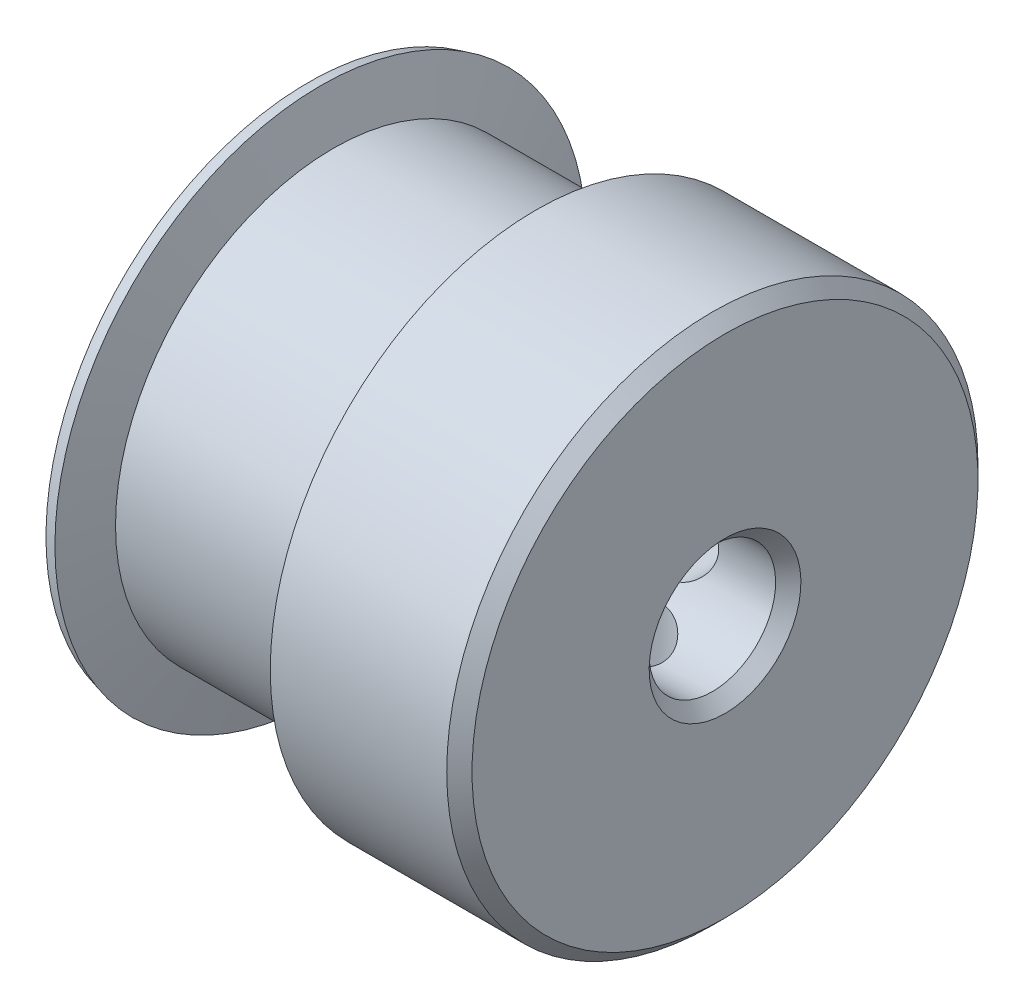
ISO-10303-21;
HEADER;
FILE_DESCRIPTION(('STEP AP214'),'2;1');
FILE_NAME('part.step','',(''),(''),'','','');
FILE_SCHEMA(('AUTOMOTIVE_DESIGN { 1 0 10303 214 1 1 1 1 }'));
ENDSEC;
DATA;
#1=APPLICATION_CONTEXT('core data for automotive mechanical design processes');
#2=APPLICATION_PROTOCOL_DEFINITION('international standard','automotive_design',2000,#1);
#3=PRODUCT_CONTEXT('',#1,'mechanical');
#4=PRODUCT('Part','Part','',(#3));
#5=PRODUCT_RELATED_PRODUCT_CATEGORY('part','',(#4));
#6=PRODUCT_DEFINITION_FORMATION('','',#4);
#7=PRODUCT_DEFINITION_CONTEXT('part definition',#1,'design');
#8=PRODUCT_DEFINITION('design','',#6,#7);
#9=PRODUCT_DEFINITION_SHAPE('','',#8);
#10=(LENGTH_UNIT() NAMED_UNIT(*) SI_UNIT(.MILLI.,.METRE.));
#11=(NAMED_UNIT(*) PLANE_ANGLE_UNIT() SI_UNIT($,.RADIAN.));
#12=(NAMED_UNIT(*) SI_UNIT($,.STERADIAN.) SOLID_ANGLE_UNIT());
#13=UNCERTAINTY_MEASURE_WITH_UNIT(LENGTH_MEASURE(1.E-05),#10,'distance_accuracy_value','');
#14=(GEOMETRIC_REPRESENTATION_CONTEXT(3) GLOBAL_UNCERTAINTY_ASSIGNED_CONTEXT((#13)) GLOBAL_UNIT_ASSIGNED_CONTEXT((#10,
#11,#12)) REPRESENTATION_CONTEXT('',''));
#15=CARTESIAN_POINT('',(0.,0.,0.));
#16=DIRECTION('',(0.,0.,1.));
#17=DIRECTION('',(1.,0.,0.));
#18=AXIS2_PLACEMENT_3D('',#15,#16,#17);
#19=CARTESIAN_POINT('',(-7.99999999999999,8.61000000000002,0.));
#20=DIRECTION('',(1.,0.,0.));
#21=DIRECTION('',(0.,1.,0.));
#22=AXIS2_PLACEMENT_3D('',#19,#20,#21);
#23=PLANE('',#22);
#24=CARTESIAN_POINT('',(-8.00000000000001,0.,0.));
#25=DIRECTION('',(-1.,0.,0.));
#26=DIRECTION('',(0.,-1.,0.));
#27=AXIS2_PLACEMENT_3D('',#24,#25,#26);
#28=CIRCLE('',#27,3.);
#29=CARTESIAN_POINT('',(-8.00000000000002,-3.,0.));
#30=VERTEX_POINT('',#29);
#31=EDGE_CURVE('E10',#30,#30,#28,.T.);
#32=ORIENTED_EDGE('',*,*,#31,.F.);
#33=EDGE_LOOP('',(#32));
#34=FACE_BOUND('',#33,.T.);
#35=CARTESIAN_POINT('',(-8.00000000000002,0.,0.));
#36=DIRECTION('',(-1.,0.,0.));
#37=DIRECTION('',(0.,-1.,0.));
#38=AXIS2_PLACEMENT_3D('',#35,#36,#37);
#39=CIRCLE('',#38,8.61000000000002);
#40=CARTESIAN_POINT('',(-8.00000000000005,-8.61000000000002,0.));
#41=VERTEX_POINT('',#40);
#42=EDGE_CURVE('E71',#41,#41,#39,.T.);
#43=ORIENTED_EDGE('',*,*,#42,.T.);
#44=EDGE_LOOP('',(#43));
#45=FACE_BOUND('',#44,.T.);
#46=ADVANCED_FACE('F31',(#34,#45),#23,.F.);
#47=CARTESIAN_POINT('',(-8.00000000000001,0.,0.));
#48=DIRECTION('',(-1.,0.,0.));
#49=DIRECTION('',(0.,-1.,0.));
#50=AXIS2_PLACEMENT_3D('',#47,#48,#49);
#51=CONICAL_SURFACE('',#50,3.,0.785398163397425);
#52=CARTESIAN_POINT('',(-7.50000000000001,0.,0.));
#53=DIRECTION('',(-1.,0.,0.));
#54=DIRECTION('',(0.,-1.,0.));
#55=AXIS2_PLACEMENT_3D('',#52,#53,#54);
#56=CIRCLE('',#55,2.50000000000003);
#57=CARTESIAN_POINT('',(-7.50000000000002,-2.50000000000003,0.));
#58=VERTEX_POINT('',#57);
#59=EDGE_CURVE('E37',#58,#58,#56,.T.);
#60=ORIENTED_EDGE('',*,*,#59,.F.);
#61=EDGE_LOOP('',(#60));
#62=FACE_BOUND('',#61,.T.);
#63=ORIENTED_EDGE('',*,*,#31,.T.);
#64=EDGE_LOOP('',(#63));
#65=FACE_BOUND('',#64,.T.);
#66=ADVANCED_FACE('F145',(#62,#65),#51,.F.);
#67=CARTESIAN_POINT('',(-8.00000000000001,0.,0.));
#68=DIRECTION('',(-1.,0.,0.));
#69=DIRECTION('',(0.,-1.,0.));
#70=AXIS2_PLACEMENT_3D('',#67,#68,#69);
#71=CYLINDRICAL_SURFACE('',#70,2.50000000000004);
#72=CARTESIAN_POINT('',(4.01203103194989,-2.00000000000008,1.5));
#73=CARTESIAN_POINT('',(4.08751000723953,-1.9999941664252,1.50000404108592));
#74=CARTESIAN_POINT('',(4.16296946602969,-2.00433633903489,1.49426852824014));
#75=CARTESIAN_POINT('',(4.31135493591211,-2.02092590613891,1.47174965152787));
#76=CARTESIAN_POINT('',(4.38427821933499,-2.03318155043105,1.45495475788936));
#77=CARTESIAN_POINT('',(4.52511467362717,-2.06362339034738,1.41143486335796));
#78=CARTESIAN_POINT('',(4.59305986998516,-2.08176666183128,1.3847815450315));
#79=CARTESIAN_POINT('',(4.72346848531782,-2.12185904995844,1.3225290928302));
#80=CARTESIAN_POINT('',(4.78593026164503,-2.14380930122424,1.28692729054693));
#81=CARTESIAN_POINT('',(4.91198004861398,-2.1922859458755,1.20271292747644));
#82=CARTESIAN_POINT('',(4.97477198907384,-2.2190437103767,1.15304179435289));
#83=CARTESIAN_POINT('',(5.09179579469165,-2.27226229431069,1.04426801309984));
#84=CARTESIAN_POINT('',(5.1460211836207,-2.29872287517111,0.98515829672961));
#85=CARTESIAN_POINT('',(5.25016484165959,-2.35175567858742,0.851442367411698));
#86=CARTESIAN_POINT('',(5.29898549561965,-2.37803133577826,0.775851995162545));
#87=CARTESIAN_POINT('',(5.38284075439433,-2.42443786983187,0.615654228271655));
#88=CARTESIAN_POINT('',(5.41788800607261,-2.44457437988743,0.531055196626327));
#89=CARTESIAN_POINT('',(5.46962695476254,-2.47470987800448,0.363771406742663));
#90=CARTESIAN_POINT('',(5.48775139291719,-2.48549303939178,0.281674698130912));
#91=CARTESIAN_POINT('',(5.50997383481302,-2.49874939277553,0.114970509382705));
#92=CARTESIAN_POINT('',(5.51408500994995,-2.50123038813315,0.03036546240015));
#93=CARTESIAN_POINT('',(5.50841728460743,-2.49783372711546,-0.127637283737313));
#94=CARTESIAN_POINT('',(5.50029750578058,-2.49295437513734,-0.201123832865638));
#95=CARTESIAN_POINT('',(5.47355123630179,-2.47707997553865,-0.345464269151771));
#96=CARTESIAN_POINT('',(5.45492396804274,-2.46608447529317,-0.416317961051205));
#97=CARTESIAN_POINT('',(5.40786546924612,-2.43884907201727,-0.554056780469084));
#98=CARTESIAN_POINT('',(5.3793779708109,-2.42257910450831,-0.620916491037621));
#99=CARTESIAN_POINT('',(5.31364641572435,-2.38609637638756,-0.748988660115615));
#100=CARTESIAN_POINT('',(5.27640008489088,-2.3658825920182,-0.810199646208015));
#101=CARTESIAN_POINT('',(5.18919193914544,-2.3203792597637,-0.933074267143204));
#102=CARTESIAN_POINT('',(5.13824272021415,-2.29477182952158,-0.993918663198197));
#103=CARTESIAN_POINT('',(5.02762691408971,-2.24255554245609,-1.10671465909275));
#104=CARTESIAN_POINT('',(4.96794852847538,-2.21594536703383,-1.1586540130834));
#105=CARTESIAN_POINT('',(4.83337762578633,-2.16111075123954,-1.25824837767417));
#106=CARTESIAN_POINT('',(4.75752345541042,-2.13305661385132,-1.30470933188632));
#107=CARTESIAN_POINT('',(4.59732480031328,-2.08250879557275,-1.38397217194232));
#108=CARTESIAN_POINT('',(4.51299631582424,-2.06000490298829,-1.41679921962189));
#109=CARTESIAN_POINT('',(4.35963740005454,-2.02895865196739,-1.46077497064843));
#110=CARTESIAN_POINT('',(4.29199039965324,-2.01833888618324,-1.47527903312665));
#111=CARTESIAN_POINT('',(4.1546574216504,-2.00392150777566,-1.49480872755284));
#112=CARTESIAN_POINT('',(4.08497391146532,-2.00011596115124,-1.49984538302907));
#113=CARTESIAN_POINT('',(3.94547934951418,-1.99988914321331,-1.50014781114183));
#114=CARTESIAN_POINT('',(3.87566825473467,-2.00347810223992,-1.49540004697658));
#115=CARTESIAN_POINT('',(3.73804368820133,-2.0175152078866,-1.47640290574941));
#116=CARTESIAN_POINT('',(3.67023183970963,-2.02796877613221,-1.46214601830139));
#117=CARTESIAN_POINT('',(3.5383164524701,-2.05431768333109,-1.42488312618657));
#118=CARTESIAN_POINT('',(3.47420839541765,-2.0702062209282,-1.40188805257361));
#119=CARTESIAN_POINT('',(3.3505533162197,-2.10571539417595,-1.34796261057072));
#120=CARTESIAN_POINT('',(3.29100802558388,-2.12533743690007,-1.31702924888211));
#121=CARTESIAN_POINT('',(3.16679094943763,-2.17036819177745,-1.24167439558511));
#122=CARTESIAN_POINT('',(3.10313019685331,-2.19618239397377,-1.19582663060301));
#123=CARTESIAN_POINT('',(2.98374554710042,-2.24821754803628,-1.09487395518699));
#124=CARTESIAN_POINT('',(2.92802933978076,-2.27443886711463,-1.03976018672401));
#125=CARTESIAN_POINT('',(2.81880702459945,-2.32835625910921,-0.91327483721275));
#126=CARTESIAN_POINT('',(2.76653030534405,-2.35580075875878,-0.840721108780175));
#127=CARTESIAN_POINT('',(2.67512825511323,-2.40537639133466,-0.686103100868002));
#128=CARTESIAN_POINT('',(2.63599420410896,-2.42751104449418,-0.604045176134684));
#129=CARTESIAN_POINT('',(2.57516282851852,-2.46252280092782,-0.43884023297212));
#130=CARTESIAN_POINT('',(2.55240480415878,-2.47595588067336,-0.35620596365124));
#131=CARTESIAN_POINT('',(2.52131642910363,-2.49440738906107,-0.187383063890839));
#132=CARTESIAN_POINT('',(2.51296974123227,-2.49943534582744,-0.101198571781951));
#133=CARTESIAN_POINT('',(2.51135642336397,-2.50040600461983,0.0598120232010013));
#134=CARTESIAN_POINT('',(2.51622769738686,-2.49747057186334,0.134620583589723));
#135=CARTESIAN_POINT('',(2.53692485633151,-2.48512948412102,0.282148755978791));
#136=CARTESIAN_POINT('',(2.55275086327149,-2.47572375706646,0.354868344701931));
#137=CARTESIAN_POINT('',(2.59425060353368,-2.45149427526968,0.495145481978814));
#138=CARTESIAN_POINT('',(2.61976262807914,-2.43675966858913,0.562767032608847));
#139=CARTESIAN_POINT('',(2.67967162650465,-2.40303337447161,0.692781972000001));
#140=CARTESIAN_POINT('',(2.7140705928095,-2.38404073252274,0.75517418419985));
#141=CARTESIAN_POINT('',(2.79495622851866,-2.34093432659387,0.880263645295965));
#142=CARTESIAN_POINT('',(2.84234974096677,-2.31648844639156,0.942258690439957));
#143=CARTESIAN_POINT('',(2.94578406566763,-2.26601907350667,1.05789751536308));
#144=CARTESIAN_POINT('',(3.00183445755782,-2.23999385274515,1.11153190956917));
#145=CARTESIAN_POINT('',(3.12931659412761,-2.18528165666211,1.21590975350571));
#146=CARTESIAN_POINT('',(3.20179751811541,-2.15667566270908,1.26542406663369));
#147=CARTESIAN_POINT('',(3.35551588471646,-2.10376464485152,1.35156817210326));
#148=CARTESIAN_POINT('',(3.43674874593133,-2.07945738811059,1.38820466322662));
#149=CARTESIAN_POINT('',(3.59909531708712,-2.04080003047968,1.44437116535133));
#150=CARTESIAN_POINT('',(3.67962626791116,-2.02577665830146,1.46509526060188));
#151=CARTESIAN_POINT('',(3.84412842665358,-2.00539032320044,1.49289268240427));
#152=CARTESIAN_POINT('',(3.92809179770861,-2.00000648744651,1.49999550595837));
#153=CARTESIAN_POINT('',(4.01203103194989,-2.00000000000008,1.5));
#154=B_SPLINE_CURVE_WITH_KNOTS('',3,(#72,#73,#74,#75,#76,#77,#78,#79,#80,#81,#82,#83,#84,#85,
#86,#87,#88,#89,#90,#91,#92,#93,#94,#95,#96,#97,#98,#99,#100,#101,#102,#103,#104,#105,#106,#107,
#108,#109,#110,#111,#112,#113,#114,#115,#116,#117,#118,#119,#120,#121,#122,#123,#124,#125,#126,
#127,#128,#129,#130,#131,#132,#133,#134,#135,#136,#137,#138,#139,#140,#141,#142,#143,#144,#145,
#146,#147,#148,#149,#150,#151,#152,#153),.UNSPECIFIED.,.T.,.F.,(4,2,2,2,2,2,2,2,2,2,2,2,2,2,2,2,
2,2,2,2,2,2,2,2,2,2,2,2,2,2,2,2,2,2,2,2,2,2,2,2,4),(0.,0.226085249493394,0.452406574330772,
0.677113624991878,0.901887762215937,1.15414462390002,1.40659128601844,1.68630157736223,
1.9657544327122,2.21853330858498,2.47107452602767,2.69230130543182,2.91354445887945,
3.13607155036377,3.35865648368879,3.60782810055849,3.85733966656909,4.13576671140277,
4.41367760154769,4.62276298054685,4.83160475643977,5.04073566011182,5.25003193304129,
5.45906724365496,5.66818149154662,5.91499438482004,6.16204457978456,6.4412182801159,
6.72020638384849,6.97891479383339,7.23732973022727,7.461293218494,7.68525920139649,
7.90563970188757,8.12606965394586,8.37042963549489,8.61506198741957,8.89071695766606,
9.16622832484807,9.41820120134355,9.66962780912277),.UNSPECIFIED.);
#155=CARTESIAN_POINT('',(4.01203103194989,-2.00000000000008,1.5));
#156=VERTEX_POINT('',#155);
#157=EDGE_CURVE('E104',#156,#156,#154,.T.);
#158=ORIENTED_EDGE('',*,*,#157,.F.);
#159=EDGE_LOOP('',(#158));
#160=FACE_BOUND('',#159,.T.);
#161=CARTESIAN_POINT('',(5.24999999999999,0.,-2.50000000000004));
#162=CARTESIAN_POINT('',(5.24999590899011,0.0767298334619909,-2.49999625789736));
#163=CARTESIAN_POINT('',(5.24407132907373,0.153582320644153,-2.49642904615013));
#164=CARTESIAN_POINT('',(5.22067568048466,0.304975509530655,-2.48249903608571));
#165=CARTESIAN_POINT('',(5.20317613814577,0.379510034596023,-2.47211948032722));
#166=CARTESIAN_POINT('',(5.15761363883313,0.523751827790813,-2.44561558054491));
#167=CARTESIAN_POINT('',(5.12960304183683,0.593481028226543,-2.42951973272947));
#168=CARTESIAN_POINT('',(5.06413966685896,0.727030318214636,-2.39295367626411));
#169=CARTESIAN_POINT('',(5.02668923303124,0.79085186941636,-2.37248455380258));
#170=CARTESIAN_POINT('',(4.94022517329141,0.916299278999292,-2.32705360719091));
#171=CARTESIAN_POINT('',(4.8905463046486,0.977384020081393,-2.30186792195988));
#172=CARTESIAN_POINT('',(4.78253279617172,1.09088270411889,-2.25030439279637));
#173=CARTESIAN_POINT('',(4.72418706281267,1.1432853494811,-2.22392505153574));
#174=CARTESIAN_POINT('',(4.59207648950325,1.24444996762972,-2.16911066995913));
#175=CARTESIAN_POINT('',(4.5172982290187,1.29197766378807,-2.14082017703652));
#176=CARTESIAN_POINT('',(4.35915342675687,1.37361437764894,-2.08938301412127));
#177=CARTESIAN_POINT('',(4.27580110375242,1.40774517335157,-2.06622802273941));
#178=CARTESIAN_POINT('',(4.12340354934674,1.45440601714219,-2.03354629660934));
#179=CARTESIAN_POINT('',(4.05576400138967,1.47016197246824,-2.02207883137595));
#180=CARTESIAN_POINT('',(3.91819628416962,1.49216172340472,-2.00590308295506));
#181=CARTESIAN_POINT('',(3.84827107124549,1.49841734556833,-2.00118639643763));
#182=CARTESIAN_POINT('',(3.70798850578265,1.50105508796006,-1.9992092246386));
#183=CARTESIAN_POINT('',(3.63763057490679,1.49741783408416,-2.00196337012722));
#184=CARTESIAN_POINT('',(3.4987212245724,1.48046060478825,-2.01453261443745));
#185=CARTESIAN_POINT('',(3.43017120415254,1.467133346201,-2.0243530243223));
#186=CARTESIAN_POINT('',(3.29746975787188,1.4317392188179,-2.04953186944262));
#187=CARTESIAN_POINT('',(3.2332729460755,1.40978748666084,-2.06481711652541));
#188=CARTESIAN_POINT('',(3.10930500907186,1.35795061770834,-2.09927051350832));
#189=CARTESIAN_POINT('',(3.04953551657606,1.32806257259702,-2.11844008623469));
#190=CARTESIAN_POINT('',(2.92501590287718,1.2551798318458,-2.16255327268989));
#191=CARTESIAN_POINT('',(2.86122190704506,1.2108072439772,-2.18792043372996));
#192=CARTESIAN_POINT('',(2.74132351633297,1.11291092784,-2.23930599764385));
#193=CARTESIAN_POINT('',(2.68522656602348,1.05937845100575,-2.26532500262153));
#194=CARTESIAN_POINT('',(2.57438701817823,0.935811834382929,-2.31935504958321));
#195=CARTESIAN_POINT('',(2.52092269398399,0.86451768270492,-2.34713836268537));
#196=CARTESIAN_POINT('',(2.42687795280207,0.712276050458962,-2.39772428433985));
#197=CARTESIAN_POINT('',(2.38629064621003,0.631333763943526,-2.42052955425519));
#198=CARTESIAN_POINT('',(2.32206781720409,0.467197585268167,-2.45730392066155));
#199=CARTESIAN_POINT('',(2.29752464428407,0.384467624173541,-2.47173957439707));
#200=CARTESIAN_POINT('',(2.26298880259461,0.215047895144601,-2.49218842813554));
#201=CARTESIAN_POINT('',(2.25297868224642,0.128363005661281,-2.49821172952741));
#202=CARTESIAN_POINT('',(2.24849215232168,-0.0337146143774338,-2.50090570374614));
#203=CARTESIAN_POINT('',(2.25209114491482,-0.109042473418755,-2.49873521714289));
#204=CARTESIAN_POINT('',(2.27042585307192,-0.257829401986098,-2.48778712087052));
#205=CARTESIAN_POINT('',(2.28516134280581,-0.331288509376143,-2.47900964518041));
#206=CARTESIAN_POINT('',(2.32454343281246,-0.47257493215765,-2.45594792442194));
#207=CARTESIAN_POINT('',(2.34894034907346,-0.54049575092852,-2.44180275662559));
#208=CARTESIAN_POINT('',(2.40667737636527,-0.6712657490873,-2.40913880862848));
#209=CARTESIAN_POINT('',(2.44001925134667,-0.734113924963945,-2.39061916586515));
#210=CARTESIAN_POINT('',(2.51855697920871,-0.860006262823901,-2.34845496237364));
#211=CARTESIAN_POINT('',(2.56462382907839,-0.922394150456874,-2.32447802739883));
#212=CARTESIAN_POINT('',(2.66539139348862,-1.03902603131017,-2.27474265574735));
#213=CARTESIAN_POINT('',(2.72010215485254,-1.09326040273742,-2.24898216586364));
#214=CARTESIAN_POINT('',(2.84491039003716,-1.19931996735583,-2.19445423909895));
#215=CARTESIAN_POINT('',(2.91608388546551,-1.24991019630918,-2.16573241746295));
#216=CARTESIAN_POINT('',(3.06721602456821,-1.33845238915671,-2.11216182066714));
#217=CARTESIAN_POINT('',(3.14716529389279,-1.37641766769784,-2.08730897997694));
#218=CARTESIAN_POINT('',(3.2962430223067,-1.43142578795779,-2.04984909240524));
#219=CARTESIAN_POINT('',(3.3639803123586,-1.45121625336193,-2.03575659328733));
#220=CARTESIAN_POINT('',(3.50253207808012,-1.48113663905974,-2.01409605743549));
#221=CARTESIAN_POINT('',(3.57334214432784,-1.49127995297633,-2.00651897642726));
#222=CARTESIAN_POINT('',(3.71637694759704,-1.50134130416634,-1.99900446616273));
#223=CARTESIAN_POINT('',(3.78860599068706,-1.50122089107871,-1.99909576445943));
#224=CARTESIAN_POINT('',(3.93189443560947,-1.4906647295933,-2.00697717892856));
#225=CARTESIAN_POINT('',(4.00295318008061,-1.48022337215761,-2.01477148138826));
#226=CARTESIAN_POINT('',(4.1384884175722,-1.45040174148915,-2.03633185242986));
#227=CARTESIAN_POINT('',(4.20311709430688,-1.43147636845353,-2.04979211805586));
#228=CARTESIAN_POINT('',(4.32833725447423,-1.38563242076995,-2.08105501960157));
#229=CARTESIAN_POINT('',(4.38892720696057,-1.35871083588481,-2.09885929040488));
#230=CARTESIAN_POINT('',(4.51431985722079,-1.29289245555734,-2.14012990550922));
#231=CARTESIAN_POINT('',(4.57834110385432,-1.25279167675754,-2.16404587582645));
#232=CARTESIAN_POINT('',(4.6993800726173,-1.16375698389085,-2.21320127030774));
#233=CARTESIAN_POINT('',(4.75639196215257,-1.11481579607798,-2.23844177205027));
#234=CARTESIAN_POINT('',(4.87135094913169,-1.00009777425734,-2.29225690291482));
#235=CARTESIAN_POINT('',(4.9279310748962,-0.932876819313902,-2.32070308663663));
#236=CARTESIAN_POINT('',(5.02909785586332,-0.788462434445584,-2.37365428872373));
#237=CARTESIAN_POINT('',(5.0736802119848,-0.711265444501533,-2.39815789310941));
#238=CARTESIAN_POINT('',(5.14778580757374,-0.551125230801446,-2.43985578654399));
#239=CARTESIAN_POINT('',(5.17772806492683,-0.468430086957206,-2.45725077479791));
#240=CARTESIAN_POINT('',(5.22272469521097,-0.297973306118801,-2.4836627300125));
#241=CARTESIAN_POINT('',(5.23783516785698,-0.210232099648606,-2.49271125871489));
#242=CARTESIAN_POINT('',(5.24669745470865,-0.101558096917536,-2.4980200116819));
#243=CARTESIAN_POINT('',(5.24793441730609,-0.0812762590282824,-2.49876114656365));
#244=CARTESIAN_POINT('',(5.24958624637085,-0.0406658206871274,-2.4997516451737));
#245=CARTESIAN_POINT('',(5.25000108432089,-0.0203372186375895,-2.50000099184319));
#246=CARTESIAN_POINT('',(5.24999999999999,0.,-2.50000000000004));
#247=B_SPLINE_CURVE_WITH_KNOTS('',3,(#161,#162,#163,#164,#165,#166,#167,#168,#169,#170,#171,
#172,#173,#174,#175,#176,#177,#178,#179,#180,#181,#182,#183,#184,#185,#186,#187,#188,#189,#190,
#191,#192,#193,#194,#195,#196,#197,#198,#199,#200,#201,#202,#203,#204,#205,#206,#207,#208,#209,
#210,#211,#212,#213,#214,#215,#216,#217,#218,#219,#220,#221,#222,#223,#224,#225,#226,#227,#228,
#229,#230,#231,#232,#233,#234,#235,#236,#237,#238,#239,#240,#241,#242,#243,#244,#245,#246),
.UNSPECIFIED.,.T.,.F.,(4,2,2,2,2,2,2,2,2,2,2,2,2,2,2,2,2,2,2,2,2,2,2,2,2,2,2,2,2,2,2,2,2,2,2,2,
2,2,2,2,2,2,4),(0.,0.23010223754865,0.460772627520014,0.690308884600015,0.919788197992278,
1.16681590732473,1.41416257934801,1.69183813189808,1.96906040692092,2.17933829855634,
2.38935420916579,2.59978170870726,2.81036753273873,3.01823267593208,3.22617409809869,
3.47046995225164,3.71500044803675,3.99360957884692,4.27206939275325,4.53296790696561,
4.79355286918237,5.01875602722427,5.24395461863456,5.46367785689773,5.68344445659026,
5.92601365818363,6.16886690081837,6.4433676242801,6.71757792616457,6.93257787314694,
7.1472788873332,7.36278425777434,7.57840681155726,7.78364098331143,7.98895251523037,
8.22578610052288,8.4628154437021,8.73854311775521,9.01436946031987,9.28175654462679,
9.5481283218445,9.60911473335177,9.67010326027639),.UNSPECIFIED.);
#248=CARTESIAN_POINT('',(5.24999999999999,0.,-2.50000000000004));
#249=VERTEX_POINT('',#248);
#250=EDGE_CURVE('E74',#249,#249,#247,.T.);
#251=ORIENTED_EDGE('',*,*,#250,.F.);
#252=EDGE_LOOP('',(#251));
#253=FACE_BOUND('',#252,.T.);
#254=CARTESIAN_POINT('',(7.50000000000001,0.,0.));
#255=DIRECTION('',(-1.,0.,0.));
#256=DIRECTION('',(0.,-1.,0.));
#257=AXIS2_PLACEMENT_3D('',#254,#255,#256);
#258=CIRCLE('',#257,2.50000000000005);
#259=CARTESIAN_POINT('',(7.5,-2.50000000000009,0.));
#260=VERTEX_POINT('',#259);
#261=EDGE_CURVE('E41',#260,#260,#258,.T.);
#262=ORIENTED_EDGE('',*,*,#261,.F.);
#263=EDGE_LOOP('',(#262));
#264=FACE_BOUND('',#263,.T.);
#265=ORIENTED_EDGE('',*,*,#59,.T.);
#266=EDGE_LOOP('',(#265));
#267=FACE_BOUND('',#266,.T.);
#268=ADVANCED_FACE('F140',(#160,#253,#264,#267),#71,.F.);
#269=CARTESIAN_POINT('',(7.50000000000001,0.,0.));
#270=DIRECTION('',(1.,0.,0.));
#271=DIRECTION('',(0.,1.,0.));
#272=AXIS2_PLACEMENT_3D('',#269,#270,#271);
#273=CONICAL_SURFACE('',#272,2.50000000000005,0.785398163397453);
#274=CARTESIAN_POINT('',(8.,0.,0.));
#275=DIRECTION('',(-1.,0.,0.));
#276=DIRECTION('',(0.,-1.,0.));
#277=AXIS2_PLACEMENT_3D('',#274,#275,#276);
#278=CIRCLE('',#277,3.00000000000005);
#279=CARTESIAN_POINT('',(7.99999999999999,-3.0000000000001,0.));
#280=VERTEX_POINT('',#279);
#281=EDGE_CURVE('E45',#280,#280,#278,.T.);
#282=ORIENTED_EDGE('',*,*,#281,.F.);
#283=EDGE_LOOP('',(#282));
#284=FACE_BOUND('',#283,.T.);
#285=ORIENTED_EDGE('',*,*,#261,.T.);
#286=EDGE_LOOP('',(#285));
#287=FACE_BOUND('',#286,.T.);
#288=ADVANCED_FACE('F134',(#284,#287),#273,.F.);
#289=CARTESIAN_POINT('',(8.00000000000001,3.,0.));
#290=DIRECTION('',(-1.,0.,0.));
#291=DIRECTION('',(0.,-1.,0.));
#292=AXIS2_PLACEMENT_3D('',#289,#290,#291);
#293=PLANE('',#292);
#294=CARTESIAN_POINT('',(7.99999999999999,0.,0.));
#295=DIRECTION('',(-1.,0.,0.));
#296=DIRECTION('',(0.,-1.,0.));
#297=AXIS2_PLACEMENT_3D('',#294,#295,#296);
#298=CIRCLE('',#297,10.);
#299=CARTESIAN_POINT('',(7.99999999999996,-10.0000000000001,0.));
#300=VERTEX_POINT('',#299);
#301=EDGE_CURVE('E50',#300,#300,#298,.T.);
#302=ORIENTED_EDGE('',*,*,#301,.F.);
#303=EDGE_LOOP('',(#302));
#304=FACE_BOUND('',#303,.T.);
#305=ORIENTED_EDGE('',*,*,#281,.T.);
#306=EDGE_LOOP('',(#305));
#307=FACE_BOUND('',#306,.T.);
#308=ADVANCED_FACE('F128',(#304,#307),#293,.F.);
#309=CARTESIAN_POINT('',(7.99999999999999,0.,0.));
#310=DIRECTION('',(-1.,0.,0.));
#311=DIRECTION('',(0.,-1.,0.));
#312=AXIS2_PLACEMENT_3D('',#309,#310,#311);
#313=CONICAL_SURFACE('',#312,10.,0.785398163397442);
#314=CARTESIAN_POINT('',(7.49999999999998,0.,0.));
#315=DIRECTION('',(-1.,0.,0.));
#316=DIRECTION('',(0.,-1.,0.));
#317=AXIS2_PLACEMENT_3D('',#314,#315,#316);
#318=CIRCLE('',#317,10.5);
#319=CARTESIAN_POINT('',(7.49999999999995,-10.5000000000001,0.));
#320=VERTEX_POINT('',#319);
#321=EDGE_CURVE('E53',#320,#320,#318,.T.);
#322=ORIENTED_EDGE('',*,*,#321,.F.);
#323=EDGE_LOOP('',(#322));
#324=FACE_BOUND('',#323,.T.);
#325=ORIENTED_EDGE('',*,*,#301,.T.);
#326=EDGE_LOOP('',(#325));
#327=FACE_BOUND('',#326,.T.);
#328=ADVANCED_FACE('F118',(#324,#327),#313,.T.);
#329=CARTESIAN_POINT('',(-8.00000000000001,0.,0.));
#330=DIRECTION('',(-1.,0.,0.));
#331=DIRECTION('',(0.,-1.,0.));
#332=AXIS2_PLACEMENT_3D('',#329,#330,#331);
#333=CYLINDRICAL_SURFACE('',#332,10.5);
#334=CARTESIAN_POINT('',(4.01203103194989,-10.3923048454133,1.5));
#335=CARTESIAN_POINT('',(3.92823790352642,-10.3923061930306,1.49999650587036));
#336=CARTESIAN_POINT('',(3.84439499739101,-10.3933292406285,1.49295498380541));
#337=CARTESIAN_POINT('',(3.67905005465139,-10.3973084943365,1.46498055103788));
#338=CARTESIAN_POINT('',(3.59755043531731,-10.4002666268523,1.44403379716319));
#339=CARTESIAN_POINT('',(3.43930950692157,-10.4077743195952,1.38888554127209));
#340=CARTESIAN_POINT('',(3.36256472337272,-10.4123227012456,1.35469385341522));
#341=CARTESIAN_POINT('',(3.21591373485064,-10.4224969995473,1.27404881916947));
#342=CARTESIAN_POINT('',(3.14600652167015,-10.4281227569754,1.22759728425554));
#343=CARTESIAN_POINT('',(3.01449481006391,-10.4398636894001,1.12339010130137));
#344=CARTESIAN_POINT('',(2.95294724655035,-10.4459818085411,1.06556292320494));
#345=CARTESIAN_POINT('',(2.84039486401959,-10.4579917733928,0.94040030922539));
#346=CARTESIAN_POINT('',(2.78939060746972,-10.463883607018,0.873064366388355));
#347=CARTESIAN_POINT('',(2.6991642086301,-10.4748077776706,0.730432788015364));
#348=CARTESIAN_POINT('',(2.65999424606106,-10.4798362672008,0.65510382466207));
#349=CARTESIAN_POINT('',(2.59488298045404,-10.4884346358972,0.498852559472326));
#350=CARTESIAN_POINT('',(2.56894104196435,-10.4920045851275,0.4179305265295));
#351=CARTESIAN_POINT('',(2.53119412672669,-10.4972628750673,0.253375547655714));
#352=CARTESIAN_POINT('',(2.51929397947521,-10.4989638773859,0.16976484380241));
#353=CARTESIAN_POINT('',(2.50967310802494,-10.5003359661288,0.00171717395880108));
#354=CARTESIAN_POINT('',(2.51195166547531,-10.5000071553918,-0.0827197499554326));
#355=CARTESIAN_POINT('',(2.53054806561175,-10.4973668209745,-0.249374244139401));
#356=CARTESIAN_POINT('',(2.54676353111178,-10.4950697559933,-0.331603499828275));
#357=CARTESIAN_POINT('',(2.5926129517243,-10.4887671405948,-0.492161696346519));
#358=CARTESIAN_POINT('',(2.62224722569074,-10.4847615495803,-0.570490544446412));
#359=CARTESIAN_POINT('',(2.69419909053757,-10.4754670527824,-0.721336475075802));
#360=CARTESIAN_POINT('',(2.73656014528902,-10.4701737612879,-0.7938325445933));
#361=CARTESIAN_POINT('',(2.83273140150509,-10.4588945002218,-0.930725865103233));
#362=CARTESIAN_POINT('',(2.88654228743231,-10.4529084892497,-0.995122631558871));
#363=CARTESIAN_POINT('',(3.00465698320689,-10.4408490370786,-1.11459224329789));
#364=CARTESIAN_POINT('',(3.06905013151179,-10.4347752923343,-1.16957676999138));
#365=CARTESIAN_POINT('',(3.20619692302201,-10.4232772040676,-1.26797242192592));
#366=CARTESIAN_POINT('',(3.2789506090591,-10.4178528638724,-1.31138348787134));
#367=CARTESIAN_POINT('',(3.43084124937953,-10.408267902622,-1.38540976140596));
#368=CARTESIAN_POINT('',(3.50998238636185,-10.4041081182741,-1.41601650188833));
#369=CARTESIAN_POINT('',(3.67235421681931,-10.3975384935672,-1.4634796778124));
#370=CARTESIAN_POINT('',(3.75558464974357,-10.395128541871,-1.48033698810227));
#371=CARTESIAN_POINT('',(3.92298843502242,-10.39235235568,-1.49970293016145));
#372=CARTESIAN_POINT('',(4.00714705144658,-10.3919683290234,-1.50233648328354));
#373=CARTESIAN_POINT('',(4.17470438571876,-10.3932402939954,-1.4935110618534));
#374=CARTESIAN_POINT('',(4.25810312481736,-10.3948962283974,-1.48205248262527));
#375=CARTESIAN_POINT('',(4.42139016697123,-10.4000452239388,-1.44547378391401));
#376=CARTESIAN_POINT('',(4.5012925772489,-10.4035299850895,-1.42041536883315));
#377=CARTESIAN_POINT('',(4.65576263004227,-10.4119371840914,-1.35741229628597));
#378=CARTESIAN_POINT('',(4.73033003162119,-10.4168596868222,-1.31946705727606));
#379=CARTESIAN_POINT('',(4.87257494174101,-10.4276298631007,-1.23146520248419));
#380=CARTESIAN_POINT('',(4.94020175285916,-10.4334836433924,-1.18132740020344));
#381=CARTESIAN_POINT('',(5.06612582466903,-10.4454381814945,-1.07047708366023));
#382=CARTESIAN_POINT('',(5.12442260799424,-10.4515389519222,-1.00976402865162));
#383=CARTESIAN_POINT('',(5.23047744577524,-10.4633553931044,-0.878937814714013));
#384=CARTESIAN_POINT('',(5.27815292368954,-10.469067821714,-0.808757379093245));
#385=CARTESIAN_POINT('',(5.36103770430169,-10.4794141616986,-0.661311528578394));
#386=CARTESIAN_POINT('',(5.39624732175336,-10.4840481003037,-0.584046292632339));
#387=CARTESIAN_POINT('',(5.45306761768668,-10.4917010838334,-0.424886943445446));
#388=CARTESIAN_POINT('',(5.47472422342051,-10.4947255774292,-0.343009499342944));
#389=CARTESIAN_POINT('',(5.50397263227985,-10.498841693374,-0.176733944284336));
#390=CARTESIAN_POINT('',(5.51156527434028,-10.4999334310144,-0.0923359839857059));
#391=CARTESIAN_POINT('',(5.51245121115825,-10.5000600575395,0.0757823479703703));
#392=CARTESIAN_POINT('',(5.50587114621372,-10.499113162668,0.15950206631294));
#393=CARTESIAN_POINT('',(5.47886891941762,-10.4953054820629,0.324631975109906));
#394=CARTESIAN_POINT('',(5.45844679024699,-10.4924447008479,0.406042171016584));
#395=CARTESIAN_POINT('',(5.40438354887875,-10.485129165407,0.56421278587294));
#396=CARTESIAN_POINT('',(5.37075039658634,-10.4806753711476,0.640975972655241));
#397=CARTESIAN_POINT('',(5.29123317004837,-10.4706642007673,0.787789279388614));
#398=CARTESIAN_POINT('',(5.24534877315631,-10.4651067955829,0.857839222474916));
#399=CARTESIAN_POINT('',(5.14217024553237,-10.4534478559761,0.98988146220199));
#400=CARTESIAN_POINT('',(5.08478235182553,-10.4473420939431,1.0518001247399));
#401=CARTESIAN_POINT('',(4.96042286177341,-10.4353066756964,1.16517537545433));
#402=CARTESIAN_POINT('',(4.89344901470248,-10.4293770612369,1.21662949973048));
#403=CARTESIAN_POINT('',(4.75142195319818,-10.4183331588892,1.30784642606695));
#404=CARTESIAN_POINT('',(4.67632951414162,-10.4132231552088,1.34754865725748));
#405=CARTESIAN_POINT('',(4.52050680949643,-10.4044472110154,1.4137192688032));
#406=CARTESIAN_POINT('',(4.43978258321174,-10.4007797507703,1.44020158441602));
#407=CARTESIAN_POINT('',(4.30090371257717,-10.396164691644,1.47306941374186));
#408=CARTESIAN_POINT('',(4.24361278039255,-10.3947247799555,1.48315321897163));
#409=CARTESIAN_POINT('',(4.12823288422495,-10.3927943948374,1.49661968631394));
#410=CARTESIAN_POINT('',(4.07014392916319,-10.3923039108028,1.50000242327743));
#411=CARTESIAN_POINT('',(4.01203103194989,-10.3923048454133,1.5));
#412=B_SPLINE_CURVE_WITH_KNOTS('',3,(#334,#335,#336,#337,#338,#339,#340,#341,#342,#343,#344,
#345,#346,#347,#348,#349,#350,#351,#352,#353,#354,#355,#356,#357,#358,#359,#360,#361,#362,#363,
#364,#365,#366,#367,#368,#369,#370,#371,#372,#373,#374,#375,#376,#377,#378,#379,#380,#381,#382,
#383,#384,#385,#386,#387,#388,#389,#390,#391,#392,#393,#394,#395,#396,#397,#398,#399,#400,#401,
#402,#403,#404,#405,#406,#407,#408,#409,#410,#411),.UNSPECIFIED.,.T.,.F.,(4,2,2,2,2,2,2,2,2,2,2,
2,2,2,2,2,2,2,2,2,2,2,2,2,2,2,2,2,2,2,2,2,2,2,2,2,2,2,4),(0.,0.251167012046919,0.50258444587566,
0.753815941026138,1.00501033579326,1.2578378673486,1.51067888333998,1.76461898005097,
2.0185468767636,2.27074366602058,2.5229276780667,2.77327488678676,3.02362804449879,
3.27484610729135,3.52607919193875,3.77955388487777,4.03302987644803,4.28667321996398,
4.54030042341252,4.79169645810015,5.04308544058024,5.29334325601319,5.54361236632939,
5.79559590756693,6.04759233730546,6.3014844113972,6.55537007444339,6.80839066602276,
7.06139616408722,7.31215031476144,7.56290387341021,7.81350657921438,8.06411588549587,
8.31685761979592,8.56965879401817,8.82374111633997,9.07755503914768,9.25174838972011,
9.42593979454138),.UNSPECIFIED.);
#413=CARTESIAN_POINT('',(4.01203103194989,-10.3923048454133,1.5));
#414=VERTEX_POINT('',#413);
#415=EDGE_CURVE('E101',#414,#414,#412,.T.);
#416=ORIENTED_EDGE('',*,*,#415,.F.);
#417=EDGE_LOOP('',(#416));
#418=FACE_BOUND('',#417,.T.);
#419=CARTESIAN_POINT('',(5.24999999999999,0.,-10.5));
#420=CARTESIAN_POINT('',(5.24999651011677,-0.0837980470596411,-10.4999987028433));
#421=CARTESIAN_POINT('',(5.24295418926089,-0.1676458582433,-10.4989863030045));
#422=CARTESIAN_POINT('',(5.214976295649,-0.333000990552146,-10.4950450575882));
#423=CARTESIAN_POINT('',(5.19402689734442,-0.414505898300242,-10.4921143049446));
#424=CARTESIAN_POINT('',(5.13887090739865,-0.572758015178188,-10.4846659524274));
#425=CARTESIAN_POINT('',(5.10467400476023,-0.649508654024681,-10.4801495125245));
#426=CARTESIAN_POINT('',(5.02401668565696,-0.796169475360501,-10.4700298362088));
#427=CARTESIAN_POINT('',(4.97755809322562,-0.866080673158,-10.4644267614754));
#428=CARTESIAN_POINT('',(4.87334374324909,-0.997587975595993,-10.4527130868134));
#429=CARTESIAN_POINT('',(4.81551803571312,-1.059128386201,-10.4465994865122));
#430=CARTESIAN_POINT('',(4.69036137819051,-1.17166693765297,-10.4345774973183));
#431=CARTESIAN_POINT('',(4.62302990160521,-1.22266449406307,-10.4286691198171));
#432=CARTESIAN_POINT('',(4.48040232591936,-1.31288381463337,-10.4176973473603));
#433=CARTESIAN_POINT('',(4.40507213057226,-1.35205218821085,-10.4126378279945));
#434=CARTESIAN_POINT('',(4.24881819076341,-1.41716017750217,-10.4039772398443));
#435=CARTESIAN_POINT('',(4.16789472289001,-1.4431004468175,-10.4003760990033));
#436=CARTESIAN_POINT('',(4.00333498525796,-1.48084398009178,-10.3950692906489));
#437=CARTESIAN_POINT('',(3.91972092010826,-1.49274223279196,-10.3933508928541));
#438=CARTESIAN_POINT('',(3.75166664184779,-1.50235815011355,-10.3919654076814));
#439=CARTESIAN_POINT('',(3.66722647205891,-1.50007655440471,-10.3922982133057));
#440=CARTESIAN_POINT('',(3.50058518200039,-1.48147527146914,-10.3949658865655));
#441=CARTESIAN_POINT('',(3.41837201693122,-1.46526102269477,-10.3972857165318));
#442=CARTESIAN_POINT('',(3.2578453705736,-1.41941958482145,-10.4036425753427));
#443=CARTESIAN_POINT('',(3.17953199023325,-1.38979204871224,-10.4076796486131));
#444=CARTESIAN_POINT('',(3.02870509033735,-1.31785428187433,-10.4170328660292));
#445=CARTESIAN_POINT('',(2.95621333142129,-1.27549903967453,-10.4223535362189));
#446=CARTESIAN_POINT('',(2.81932618171604,-1.17934026858059,-10.433671108351));
#447=CARTESIAN_POINT('',(2.75493127390508,-1.12553605726885,-10.4396680505928));
#448=CARTESIAN_POINT('',(2.63545439532804,-1.00742618807161,-10.4517290352068));
#449=CARTESIAN_POINT('',(2.58046208241006,-0.943029806366439,-10.457793193268));
#450=CARTESIAN_POINT('',(2.4820522481651,-0.805873739101358,-10.469254768434));
#451=CARTESIAN_POINT('',(2.43863476937404,-0.733114022808759,-10.4746521830884));
#452=CARTESIAN_POINT('',(2.36460384375105,-0.581221559720791,-10.4841770297021));
#453=CARTESIAN_POINT('',(2.33399691787929,-0.502085591600507,-10.4883038145903));
#454=CARTESIAN_POINT('',(2.28653179602037,-0.339725024065671,-10.4948168991903));
#455=CARTESIAN_POINT('',(2.26967275771363,-0.256500675473486,-10.4972033055324));
#456=CARTESIAN_POINT('',(2.25030027988467,-0.0891000167924843,-10.4999527092956));
#457=CARTESIAN_POINT('',(2.24766350514862,-0.0049382546568185,-10.5003331021836));
#458=CARTESIAN_POINT('',(2.25648360601506,0.162626137734946,-10.4990748545078));
#459=CARTESIAN_POINT('',(2.26794008697381,0.246028789182018,-10.4974362704799));
#460=CARTESIAN_POINT('',(2.30451895619603,0.40933681348834,-10.4923349529923));
#461=CARTESIAN_POINT('',(2.32958164438466,0.489255828690066,-10.4888801904757));
#462=CARTESIAN_POINT('',(2.39259880447155,0.643757208018486,-10.4805328070433));
#463=CARTESIAN_POINT('',(2.43055383238434,0.718339341810785,-10.4756401241148));
#464=CARTESIAN_POINT('',(2.51857036274059,0.860594771848368,-10.464917828782));
#465=CARTESIAN_POINT('',(2.56871057227908,0.928218909523452,-10.4590822113691));
#466=CARTESIAN_POINT('',(2.67956405703919,1.05413647110362,-10.4471433482308));
#467=CARTESIAN_POINT('',(2.74027788681349,1.11242940530891,-10.4410400884811));
#468=CARTESIAN_POINT('',(2.87110252572334,1.21847523465573,-10.4291991012728));
#469=CARTESIAN_POINT('',(2.94128045272538,1.26614572563626,-10.4234644616139));
#470=CARTESIAN_POINT('',(3.08871988995299,1.34902176565433,-10.4130635361061));
#471=CARTESIAN_POINT('',(3.1659812230437,1.3842276262881,-10.4083972235519));
#472=CARTESIAN_POINT('',(3.32514247837971,1.44104558068897,-10.4006832769632));
#473=CARTESIAN_POINT('',(3.40702631913097,1.46270197598975,-10.3976303728443));
#474=CARTESIAN_POINT('',(3.5733154207917,1.49194779900112,-10.3934745694833));
#475=CARTESIAN_POINT('',(3.65772052475826,1.49953810044762,-10.3923715491216));
#476=CARTESIAN_POINT('',(3.82583536989096,1.50041692780655,-10.3922446330881));
#477=CARTESIAN_POINT('',(3.90954444874148,1.49383498025852,-10.3932019074239));
#478=CARTESIAN_POINT('',(4.07465259304384,1.46683271888097,-10.3970469315899));
#479=CARTESIAN_POINT('',(4.15605166087576,1.4464124193101,-10.399934679431));
#480=CARTESIAN_POINT('',(4.31419894883338,1.39235734174344,-10.4073089210814));
#481=CARTESIAN_POINT('',(4.39095002382227,1.35873077221948,-10.4117944216327));
#482=CARTESIAN_POINT('',(4.53774183371505,1.27923048152313,-10.4218600929554));
#483=CARTESIAN_POINT('',(4.60778238422354,1.23335642393877,-10.4274402937947));
#484=CARTESIAN_POINT('',(4.73982436389668,1.13018960597319,-10.4391274698967));
#485=CARTESIAN_POINT('',(4.80175030890167,1.07280069705271,-10.4452386169774));
#486=CARTESIAN_POINT('',(4.91513978057417,0.948436134990838,-10.4572636654055));
#487=CARTESIAN_POINT('',(4.96660086284136,0.88145824825118,-10.4631775204));
#488=CARTESIAN_POINT('',(5.0578256790271,0.739427568400358,-10.4741749686943));
#489=CARTESIAN_POINT('',(5.09752999061841,0.664336288090697,-10.4792542883965));
#490=CARTESIAN_POINT('',(5.16370480800457,0.508515966277501,-10.4879681705617));
#491=CARTESIAN_POINT('',(5.19018922607428,0.427792953899209,-10.4916042510232));
#492=CARTESIAN_POINT('',(5.22306269018446,0.288908522998142,-10.4961777225379));
#493=CARTESIAN_POINT('',(5.23314902770367,0.231610424383904,-10.4976038314235));
#494=CARTESIAN_POINT('',(5.24661885681614,0.116216191024221,-10.4995154149335));
#495=CARTESIAN_POINT('',(5.25000242048884,0.0581200648672708,-10.500000899673));
#496=CARTESIAN_POINT('',(5.24999999999999,0.,-10.5));
#497=B_SPLINE_CURVE_WITH_KNOTS('',3,(#419,#420,#421,#422,#423,#424,#425,#426,#427,#428,#429,
#430,#431,#432,#433,#434,#435,#436,#437,#438,#439,#440,#441,#442,#443,#444,#445,#446,#447,#448,
#449,#450,#451,#452,#453,#454,#455,#456,#457,#458,#459,#460,#461,#462,#463,#464,#465,#466,#467,
#468,#469,#470,#471,#472,#473,#474,#475,#476,#477,#478,#479,#480,#481,#482,#483,#484,#485,#486,
#487,#488,#489,#490,#491,#492,#493,#494,#495,#496),.UNSPECIFIED.,.T.,.F.,(4,2,2,2,2,2,2,2,2,2,2,
2,2,2,2,2,2,2,2,2,2,2,2,2,2,2,2,2,2,2,2,2,2,2,2,2,2,2,4),(0.,0.251181790014658,
0.502613663993753,0.753861991045278,1.00507296375776,1.2578811514321,1.51070334962241,
1.76465016063836,2.01858442290987,2.27079088981465,2.52298420087169,2.77328562434791,
3.02359352365118,3.27479726716424,3.52601598791197,3.77951067530022,4.03300629423345,
4.28663079365746,4.54023975258936,4.79164584064564,5.04304488891045,5.29334968302705,
5.54366527353743,5.79564281989972,6.04763358566373,6.30151593543519,6.5553919380977,
6.80843346555637,7.06145927444514,7.31218238885341,7.5629052449241,7.81347250803813,
8.06404665440029,8.31680735632106,8.56962703086835,8.82370353749484,9.07751209384601,
9.2517268808682,9.42593979443109),.UNSPECIFIED.);
#498=CARTESIAN_POINT('',(5.24999999999999,0.,-10.5));
#499=VERTEX_POINT('',#498);
#500=EDGE_CURVE('E81',#499,#499,#497,.T.);
#501=ORIENTED_EDGE('',*,*,#500,.F.);
#502=EDGE_LOOP('',(#501));
#503=FACE_BOUND('',#502,.T.);
#504=CARTESIAN_POINT('',(0.524062063899806,0.,0.));
#505=DIRECTION('',(-1.,0.,0.));
#506=DIRECTION('',(0.,-1.,0.));
#507=AXIS2_PLACEMENT_3D('',#504,#505,#506);
#508=CIRCLE('',#507,10.5);
#509=CARTESIAN_POINT('',(0.524062063899774,-10.5000000000001,0.));
#510=VERTEX_POINT('',#509);
#511=EDGE_CURVE('E56',#510,#510,#508,.T.);
#512=ORIENTED_EDGE('',*,*,#511,.F.);
#513=EDGE_LOOP('',(#512));
#514=FACE_BOUND('',#513,.T.);
#515=ORIENTED_EDGE('',*,*,#321,.T.);
#516=EDGE_LOOP('',(#515));
#517=FACE_BOUND('',#516,.T.);
#518=ADVANCED_FACE('F114',(#418,#503,#514,#517),#333,.T.);
#519=CARTESIAN_POINT('',(0.524062063899806,0.,0.));
#520=DIRECTION('',(1.,0.,0.));
#521=DIRECTION('',(0.,1.,0.));
#522=AXIS2_PLACEMENT_3D('',#519,#520,#521);
#523=CONICAL_SURFACE('',#522,10.5,1.30899693899575);
#524=CARTESIAN_POINT('',(0.0176380902049949,0.,0.));
#525=DIRECTION('',(-1.,0.,0.));
#526=DIRECTION('',(0.,-1.,0.));
#527=AXIS2_PLACEMENT_3D('',#524,#525,#526);
#528=CIRCLE('',#527,8.61000000000004);
#529=CARTESIAN_POINT('',(0.0176380902049688,-8.61000000000006,0.));
#530=VERTEX_POINT('',#529);
#531=EDGE_CURVE('E59',#530,#530,#528,.T.);
#532=ORIENTED_EDGE('',*,*,#531,.F.);
#533=EDGE_LOOP('',(#532));
#534=FACE_BOUND('',#533,.T.);
#535=ORIENTED_EDGE('',*,*,#511,.T.);
#536=EDGE_LOOP('',(#535));
#537=FACE_BOUND('',#536,.T.);
#538=ADVANCED_FACE('F117',(#534,#537),#523,.T.);
#539=CARTESIAN_POINT('',(-8.00000000000001,0.,0.));
#540=DIRECTION('',(-1.,0.,0.));
#541=DIRECTION('',(0.,-1.,0.));
#542=AXIS2_PLACEMENT_3D('',#539,#540,#541);
#543=CYLINDRICAL_SURFACE('',#542,8.61000000000003);
#544=CARTESIAN_POINT('',(-7.482361909795,0.,0.));
#545=DIRECTION('',(-1.,0.,0.));
#546=DIRECTION('',(0.,-1.,0.));
#547=AXIS2_PLACEMENT_3D('',#544,#545,#546);
#548=CIRCLE('',#547,8.61000000000003);
#549=CARTESIAN_POINT('',(-7.48236190979503,-8.61000000000003,0.));
#550=VERTEX_POINT('',#549);
#551=EDGE_CURVE('E62',#550,#550,#548,.T.);
#552=ORIENTED_EDGE('',*,*,#551,.F.);
#553=EDGE_LOOP('',(#552));
#554=FACE_BOUND('',#553,.T.);
#555=ORIENTED_EDGE('',*,*,#531,.T.);
#556=EDGE_LOOP('',(#555));
#557=FACE_BOUND('',#556,.T.);
#558=ADVANCED_FACE('F174',(#554,#557),#543,.T.);
#559=CARTESIAN_POINT('',(-7.482361909795,0.,0.));
#560=DIRECTION('',(-1.,0.,0.));
#561=DIRECTION('',(0.,-1.,0.));
#562=AXIS2_PLACEMENT_3D('',#559,#560,#561);
#563=CONICAL_SURFACE('',#562,8.61000000000003,1.30899693899575);
#564=CARTESIAN_POINT('',(-7.98878588348982,0.,0.));
#565=DIRECTION('',(-1.,0.,0.));
#566=DIRECTION('',(0.,-1.,0.));
#567=AXIS2_PLACEMENT_3D('',#564,#565,#566);
#568=CIRCLE('',#567,10.5);
#569=CARTESIAN_POINT('',(-7.98878588348985,-10.5,0.));
#570=VERTEX_POINT('',#569);
#571=EDGE_CURVE('E65',#570,#570,#568,.T.);
#572=ORIENTED_EDGE('',*,*,#571,.F.);
#573=EDGE_LOOP('',(#572));
#574=FACE_BOUND('',#573,.T.);
#575=ORIENTED_EDGE('',*,*,#551,.T.);
#576=EDGE_LOOP('',(#575));
#577=FACE_BOUND('',#576,.T.);
#578=ADVANCED_FACE('F168',(#574,#577),#563,.T.);
#579=CARTESIAN_POINT('',(-7.98878588348982,0.,0.));
#580=DIRECTION('',(1.,0.,0.));
#581=DIRECTION('',(0.,1.,0.));
#582=AXIS2_PLACEMENT_3D('',#579,#580,#581);
#583=CONICAL_SURFACE('',#582,10.5,0.261799387799152);
#584=CARTESIAN_POINT('',(-8.47174879663435,0.,0.));
#585=DIRECTION('',(-1.,0.,0.));
#586=DIRECTION('',(0.,-1.,0.));
#587=AXIS2_PLACEMENT_3D('',#584,#585,#586);
#588=CIRCLE('',#587,10.3705904774488);
#589=CARTESIAN_POINT('',(-8.47174879663439,-10.3705904774488,0.));
#590=VERTEX_POINT('',#589);
#591=EDGE_CURVE('E68',#590,#590,#588,.T.);
#592=ORIENTED_EDGE('',*,*,#591,.F.);
#593=EDGE_LOOP('',(#592));
#594=FACE_BOUND('',#593,.T.);
#595=ORIENTED_EDGE('',*,*,#571,.T.);
#596=EDGE_LOOP('',(#595));
#597=FACE_BOUND('',#596,.T.);
#598=ADVANCED_FACE('F163',(#594,#597),#583,.T.);
#599=CARTESIAN_POINT('',(-8.47174879663435,0.,0.));
#600=DIRECTION('',(-1.,0.,0.));
#601=DIRECTION('',(0.,-1.,0.));
#602=AXIS2_PLACEMENT_3D('',#599,#600,#601);
#603=CONICAL_SURFACE('',#602,10.3705904774488,1.30899693899574);
#604=ORIENTED_EDGE('',*,*,#42,.F.);
#605=EDGE_LOOP('',(#604));
#606=FACE_BOUND('',#605,.T.);
#607=ORIENTED_EDGE('',*,*,#591,.T.);
#608=EDGE_LOOP('',(#607));
#609=FACE_BOUND('',#608,.T.);
#610=ADVANCED_FACE('F160',(#606,#609),#603,.F.);
#611=CARTESIAN_POINT('',(3.74999999999999,0.,-10.501));
#612=DIRECTION('',(0.,0.,1.));
#613=DIRECTION('',(1.,0.,0.));
#614=AXIS2_PLACEMENT_3D('',#611,#612,#613);
#615=CYLINDRICAL_SURFACE('',#614,1.5);
#616=ORIENTED_EDGE('',*,*,#500,.T.);
#617=EDGE_LOOP('',(#616));
#618=FACE_BOUND('',#617,.T.);
#619=ORIENTED_EDGE('',*,*,#250,.T.);
#620=EDGE_LOOP('',(#619));
#621=FACE_BOUND('',#620,.T.);
#622=ADVANCED_FACE('F86',(#618,#621),#615,.F.);
#623=CARTESIAN_POINT('',(4.01203103194989,-10.5010000000001,0.));
#624=DIRECTION('',(0.,1.,0.));
#625=DIRECTION('',(0.,0.,1.));
#626=AXIS2_PLACEMENT_3D('',#623,#624,#625);
#627=CYLINDRICAL_SURFACE('',#626,1.5);
#628=ORIENTED_EDGE('',*,*,#415,.T.);
#629=EDGE_LOOP('',(#628));
#630=FACE_BOUND('',#629,.T.);
#631=ORIENTED_EDGE('',*,*,#157,.T.);
#632=EDGE_LOOP('',(#631));
#633=FACE_BOUND('',#632,.T.);
#634=ADVANCED_FACE('F92',(#630,#633),#627,.F.);
#635=CLOSED_SHELL('',(#46,#66,#268,#288,#308,#328,#518,#538,#558,#578,#598,#610,#622,#634));
#636=MANIFOLD_SOLID_BREP('B2',#635);
#637=ADVANCED_BREP_SHAPE_REPRESENTATION('',(#18,#636),#14);
#638=SHAPE_DEFINITION_REPRESENTATION(#9,#637);
ENDSEC;
END-ISO-10303-21;
